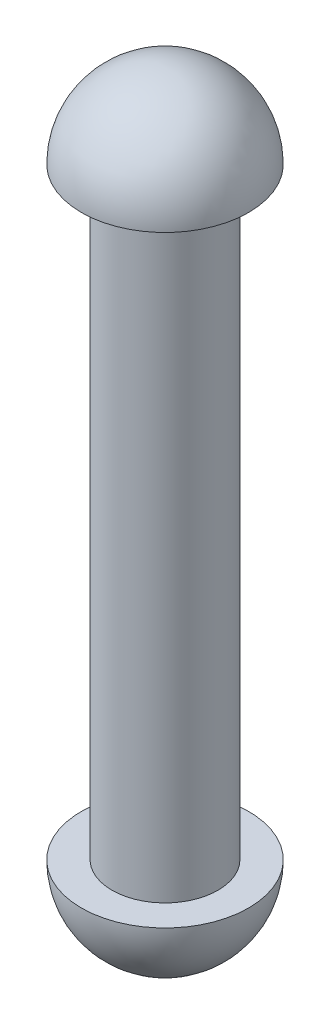
ISO-10303-21;
HEADER;
FILE_DESCRIPTION(('STEP AP214'),'2;1');
FILE_NAME('part.step','',(''),(''),'','','');
FILE_SCHEMA(('AUTOMOTIVE_DESIGN { 1 0 10303 214 1 1 1 1 }'));
ENDSEC;
DATA;
#1=APPLICATION_CONTEXT('core data for automotive mechanical design processes');
#2=APPLICATION_PROTOCOL_DEFINITION('international standard','automotive_design',2000,#1);
#3=PRODUCT_CONTEXT('',#1,'mechanical');
#4=PRODUCT('Part','Part','',(#3));
#5=PRODUCT_RELATED_PRODUCT_CATEGORY('part','',(#4));
#6=PRODUCT_DEFINITION_FORMATION('','',#4);
#7=PRODUCT_DEFINITION_CONTEXT('part definition',#1,'design');
#8=PRODUCT_DEFINITION('design','',#6,#7);
#9=PRODUCT_DEFINITION_SHAPE('','',#8);
#10=(LENGTH_UNIT() NAMED_UNIT(*) SI_UNIT(.MILLI.,.METRE.));
#11=(NAMED_UNIT(*) PLANE_ANGLE_UNIT() SI_UNIT($,.RADIAN.));
#12=(NAMED_UNIT(*) SI_UNIT($,.STERADIAN.) SOLID_ANGLE_UNIT());
#13=UNCERTAINTY_MEASURE_WITH_UNIT(LENGTH_MEASURE(1.E-05),#10,'distance_accuracy_value','');
#14=(GEOMETRIC_REPRESENTATION_CONTEXT(3) GLOBAL_UNCERTAINTY_ASSIGNED_CONTEXT((#13)) GLOBAL_UNIT_ASSIGNED_CONTEXT((#10,
#11,#12)) REPRESENTATION_CONTEXT('',''));
#15=CARTESIAN_POINT('',(0.,0.,0.));
#16=DIRECTION('',(0.,0.,1.));
#17=DIRECTION('',(1.,0.,0.));
#18=AXIS2_PLACEMENT_3D('',#15,#16,#17);
#19=CARTESIAN_POINT('',(0.,-216.,0.));
#20=DIRECTION('',(0.,1.,0.));
#21=DIRECTION('',(1.,0.,0.));
#22=AXIS2_PLACEMENT_3D('',#19,#20,#21);
#23=SPHERICAL_SURFACE('',#22,30.);
#24=CARTESIAN_POINT('',(0.,-216.,0.));
#25=DIRECTION('',(0.,1.,0.));
#26=DIRECTION('',(0.,0.,1.));
#27=AXIS2_PLACEMENT_3D('',#24,#25,#26);
#28=CIRCLE('',#27,30.);
#29=CARTESIAN_POINT('',(0.,-216.,30.));
#30=VERTEX_POINT('',#29);
#31=EDGE_CURVE('E48',#30,#30,#28,.T.);
#32=ORIENTED_EDGE('',*,*,#31,.F.);
#33=EDGE_LOOP('',(#32));
#34=FACE_BOUND('',#33,.T.);
#35=ADVANCED_FACE('F34',(#34),#23,.T.);
#36=CARTESIAN_POINT('',(0.,0.,0.));
#37=DIRECTION('',(0.,1.,0.));
#38=DIRECTION('',(1.,0.,0.));
#39=AXIS2_PLACEMENT_3D('',#36,#37,#38);
#40=SPHERICAL_SURFACE('',#39,30.);
#41=CARTESIAN_POINT('',(0.,0.,0.));
#42=DIRECTION('',(0.,1.,0.));
#43=DIRECTION('',(0.,0.,1.));
#44=AXIS2_PLACEMENT_3D('',#41,#42,#43);
#45=CIRCLE('',#44,30.);
#46=CARTESIAN_POINT('',(0.,0.,30.));
#47=VERTEX_POINT('',#46);
#48=EDGE_CURVE('E10',#47,#47,#45,.T.);
#49=ORIENTED_EDGE('',*,*,#48,.T.);
#50=EDGE_LOOP('',(#49));
#51=FACE_BOUND('',#50,.T.);
#52=ADVANCED_FACE('F57',(#51),#40,.T.);
#53=CARTESIAN_POINT('',(0.,0.,0.));
#54=DIRECTION('',(0.,-1.,0.));
#55=DIRECTION('',(0.,0.,-1.));
#56=AXIS2_PLACEMENT_3D('',#53,#54,#55);
#57=PLANE('',#56);
#58=CARTESIAN_POINT('',(0.,0.,0.));
#59=DIRECTION('',(0.,1.,0.));
#60=DIRECTION('',(0.,0.,1.));
#61=AXIS2_PLACEMENT_3D('',#58,#59,#60);
#62=CIRCLE('',#61,19.);
#63=CARTESIAN_POINT('',(0.,0.,19.));
#64=VERTEX_POINT('',#63);
#65=EDGE_CURVE('E40',#64,#64,#62,.T.);
#66=ORIENTED_EDGE('',*,*,#65,.T.);
#67=EDGE_LOOP('',(#66));
#68=FACE_BOUND('',#67,.T.);
#69=ORIENTED_EDGE('',*,*,#48,.F.);
#70=EDGE_LOOP('',(#69));
#71=FACE_BOUND('',#70,.T.);
#72=ADVANCED_FACE('F61',(#68,#71),#57,.T.);
#73=CARTESIAN_POINT('',(0.,0.,0.));
#74=DIRECTION('',(0.,1.,0.));
#75=DIRECTION('',(0.,0.,1.));
#76=AXIS2_PLACEMENT_3D('',#73,#74,#75);
#77=CYLINDRICAL_SURFACE('',#76,19.);
#78=CARTESIAN_POINT('',(0.,-216.,0.));
#79=DIRECTION('',(0.,1.,0.));
#80=DIRECTION('',(0.,0.,1.));
#81=AXIS2_PLACEMENT_3D('',#78,#79,#80);
#82=CIRCLE('',#81,19.);
#83=CARTESIAN_POINT('',(0.,-216.,19.));
#84=VERTEX_POINT('',#83);
#85=EDGE_CURVE('E44',#84,#84,#82,.T.);
#86=ORIENTED_EDGE('',*,*,#85,.T.);
#87=EDGE_LOOP('',(#86));
#88=FACE_BOUND('',#87,.T.);
#89=ORIENTED_EDGE('',*,*,#65,.F.);
#90=EDGE_LOOP('',(#89));
#91=FACE_BOUND('',#90,.T.);
#92=ADVANCED_FACE('F65',(#88,#91),#77,.T.);
#93=CARTESIAN_POINT('',(0.,-216.,0.));
#94=DIRECTION('',(0.,-1.,0.));
#95=DIRECTION('',(0.,0.,-1.));
#96=AXIS2_PLACEMENT_3D('',#93,#94,#95);
#97=PLANE('',#96);
#98=ORIENTED_EDGE('',*,*,#85,.F.);
#99=EDGE_LOOP('',(#98));
#100=FACE_BOUND('',#99,.T.);
#101=ORIENTED_EDGE('',*,*,#31,.T.);
#102=EDGE_LOOP('',(#101));
#103=FACE_BOUND('',#102,.T.);
#104=ADVANCED_FACE('F54',(#100,#103),#97,.F.);
#105=CLOSED_SHELL('',(#35,#52,#72,#92,#104));
#106=MANIFOLD_SOLID_BREP('B2',#105);
#107=ADVANCED_BREP_SHAPE_REPRESENTATION('',(#18,#106),#14);
#108=SHAPE_DEFINITION_REPRESENTATION(#9,#107);
ENDSEC;
END-ISO-10303-21;
